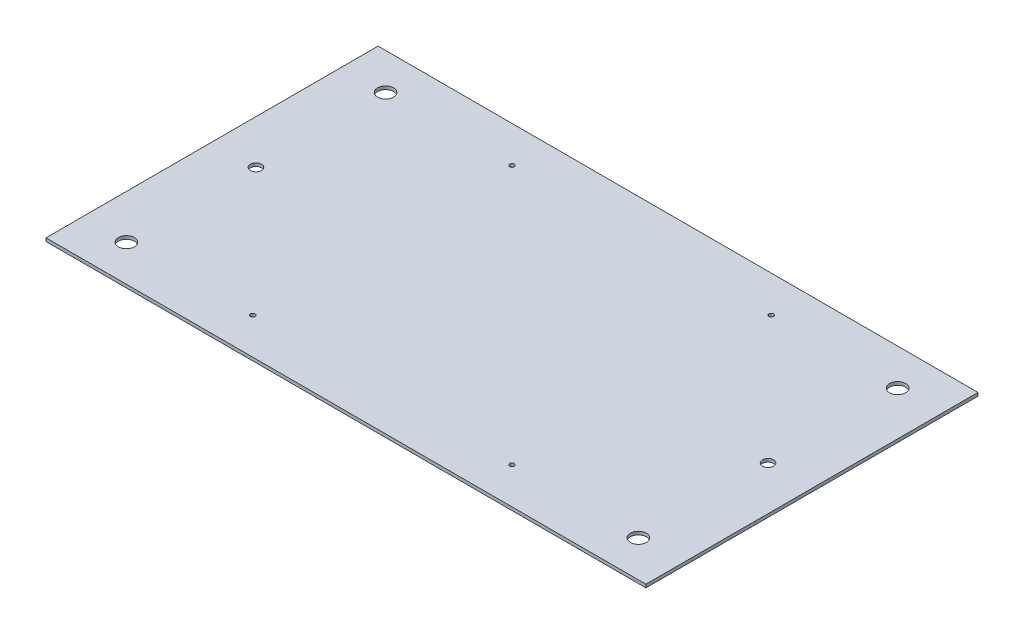
ISO-10303-21;
HEADER;
FILE_DESCRIPTION(('STEP AP214'),'2;1');
FILE_NAME('part.step','',(''),(''),'','','');
FILE_SCHEMA(('AUTOMOTIVE_DESIGN { 1 0 10303 214 1 1 1 1 }'));
ENDSEC;
DATA;
#1=APPLICATION_CONTEXT('core data for automotive mechanical design processes');
#2=APPLICATION_PROTOCOL_DEFINITION('international standard','automotive_design',2000,#1);
#3=PRODUCT_CONTEXT('',#1,'mechanical');
#4=PRODUCT('Part','Part','',(#3));
#5=PRODUCT_RELATED_PRODUCT_CATEGORY('part','',(#4));
#6=PRODUCT_DEFINITION_FORMATION('','',#4);
#7=PRODUCT_DEFINITION_CONTEXT('part definition',#1,'design');
#8=PRODUCT_DEFINITION('design','',#6,#7);
#9=PRODUCT_DEFINITION_SHAPE('','',#8);
#10=(LENGTH_UNIT() NAMED_UNIT(*) SI_UNIT(.MILLI.,.METRE.));
#11=(NAMED_UNIT(*) PLANE_ANGLE_UNIT() SI_UNIT($,.RADIAN.));
#12=(NAMED_UNIT(*) SI_UNIT($,.STERADIAN.) SOLID_ANGLE_UNIT());
#13=UNCERTAINTY_MEASURE_WITH_UNIT(LENGTH_MEASURE(1.E-05),#10,'distance_accuracy_value','');
#14=(GEOMETRIC_REPRESENTATION_CONTEXT(3) GLOBAL_UNCERTAINTY_ASSIGNED_CONTEXT((#13)) GLOBAL_UNIT_ASSIGNED_CONTEXT((#10,
#11,#12)) REPRESENTATION_CONTEXT('',''));
#15=CARTESIAN_POINT('',(0.,0.,0.));
#16=DIRECTION('',(0.,0.,1.));
#17=DIRECTION('',(1.,0.,0.));
#18=AXIS2_PLACEMENT_3D('',#15,#16,#17);
#19=CARTESIAN_POINT('',(0.,3.,0.));
#20=DIRECTION('',(1.,0.,0.));
#21=DIRECTION('',(0.,0.,-1.));
#22=AXIS2_PLACEMENT_3D('',#19,#20,#21);
#23=PLANE('',#22);
#24=DIRECTION('',(0.,0.,1.));
#25=VECTOR('',#24,1.);
#26=CARTESIAN_POINT('',(0.,0.,0.));
#27=LINE('',#26,#25);
#28=CARTESIAN_POINT('',(0.,0.,-310.));
#29=VERTEX_POINT('',#28);
#30=CARTESIAN_POINT('',(0.,0.,0.));
#31=VERTEX_POINT('',#30);
#32=EDGE_CURVE('E110',#29,#31,#27,.T.);
#33=ORIENTED_EDGE('',*,*,#32,.T.);
#34=DIRECTION('',(0.,-1.,0.));
#35=VECTOR('',#34,1.);
#36=CARTESIAN_POINT('',(0.,3.,0.));
#37=LINE('',#36,#35);
#38=CARTESIAN_POINT('',(0.,3.,0.));
#39=VERTEX_POINT('',#38);
#40=EDGE_CURVE('E11',#39,#31,#37,.T.);
#41=ORIENTED_EDGE('',*,*,#40,.F.);
#42=DIRECTION('',(0.,0.,1.));
#43=VECTOR('',#42,1.);
#44=CARTESIAN_POINT('',(0.,3.,0.));
#45=LINE('',#44,#43);
#46=CARTESIAN_POINT('',(0.,3.,-310.));
#47=VERTEX_POINT('',#46);
#48=EDGE_CURVE('E94',#47,#39,#45,.T.);
#49=ORIENTED_EDGE('',*,*,#48,.F.);
#50=DIRECTION('',(0.,-1.,0.));
#51=VECTOR('',#50,1.);
#52=CARTESIAN_POINT('',(0.,3.,-310.));
#53=LINE('',#52,#51);
#54=EDGE_CURVE('E106',#47,#29,#53,.T.);
#55=ORIENTED_EDGE('',*,*,#54,.T.);
#56=EDGE_LOOP('',(#33,#41,#49,#55));
#57=FACE_BOUND('',#56,.T.);
#58=ADVANCED_FACE('F42',(#57),#23,.F.);
#59=CARTESIAN_POINT('',(0.,3.,0.));
#60=DIRECTION('',(0.,0.,-1.));
#61=DIRECTION('',(-1.,0.,0.));
#62=AXIS2_PLACEMENT_3D('',#59,#60,#61);
#63=PLANE('',#62);
#64=DIRECTION('',(1.,0.,0.));
#65=VECTOR('',#64,1.);
#66=CARTESIAN_POINT('',(0.,0.,0.));
#67=LINE('',#66,#65);
#68=CARTESIAN_POINT('',(560.,0.,0.));
#69=VERTEX_POINT('',#68);
#70=EDGE_CURVE('E99',#31,#69,#67,.T.);
#71=ORIENTED_EDGE('',*,*,#70,.T.);
#72=DIRECTION('',(0.,-1.,0.));
#73=VECTOR('',#72,1.);
#74=CARTESIAN_POINT('',(560.,3.,0.));
#75=LINE('',#74,#73);
#76=CARTESIAN_POINT('',(560.,3.,0.));
#77=VERTEX_POINT('',#76);
#78=EDGE_CURVE('E51',#77,#69,#75,.T.);
#79=ORIENTED_EDGE('',*,*,#78,.F.);
#80=DIRECTION('',(1.,0.,0.));
#81=VECTOR('',#80,1.);
#82=CARTESIAN_POINT('',(0.,3.,0.));
#83=LINE('',#82,#81);
#84=EDGE_CURVE('E89',#39,#77,#83,.T.);
#85=ORIENTED_EDGE('',*,*,#84,.F.);
#86=ORIENTED_EDGE('',*,*,#40,.T.);
#87=EDGE_LOOP('',(#71,#79,#85,#86));
#88=FACE_BOUND('',#87,.T.);
#89=ADVANCED_FACE('F98',(#88),#63,.F.);
#90=CARTESIAN_POINT('',(560.,3.,0.));
#91=DIRECTION('',(-1.,0.,0.));
#92=DIRECTION('',(0.,0.,1.));
#93=AXIS2_PLACEMENT_3D('',#90,#91,#92);
#94=PLANE('',#93);
#95=DIRECTION('',(0.,0.,-1.));
#96=VECTOR('',#95,1.);
#97=CARTESIAN_POINT('',(560.,0.,0.));
#98=LINE('',#97,#96);
#99=CARTESIAN_POINT('',(560.,0.,-310.));
#100=VERTEX_POINT('',#99);
#101=EDGE_CURVE('E76',#69,#100,#98,.T.);
#102=ORIENTED_EDGE('',*,*,#101,.T.);
#103=DIRECTION('',(0.,-1.,0.));
#104=VECTOR('',#103,1.);
#105=CARTESIAN_POINT('',(560.,3.,-310.));
#106=LINE('',#105,#104);
#107=CARTESIAN_POINT('',(560.,3.,-310.));
#108=VERTEX_POINT('',#107);
#109=EDGE_CURVE('E101',#108,#100,#106,.T.);
#110=ORIENTED_EDGE('',*,*,#109,.F.);
#111=DIRECTION('',(0.,0.,-1.));
#112=VECTOR('',#111,1.);
#113=CARTESIAN_POINT('',(560.,3.,0.));
#114=LINE('',#113,#112);
#115=EDGE_CURVE('E92',#77,#108,#114,.T.);
#116=ORIENTED_EDGE('',*,*,#115,.F.);
#117=ORIENTED_EDGE('',*,*,#78,.T.);
#118=EDGE_LOOP('',(#102,#110,#116,#117));
#119=FACE_BOUND('',#118,.T.);
#120=ADVANCED_FACE('F102',(#119),#94,.F.);
#121=CARTESIAN_POINT('',(0.,3.,-310.));
#122=DIRECTION('',(0.,0.,1.));
#123=DIRECTION('',(1.,0.,0.));
#124=AXIS2_PLACEMENT_3D('',#121,#122,#123);
#125=PLANE('',#124);
#126=DIRECTION('',(-1.,0.,0.));
#127=VECTOR('',#126,1.);
#128=CARTESIAN_POINT('',(0.,0.,-310.));
#129=LINE('',#128,#127);
#130=EDGE_CURVE('E82',#100,#29,#129,.T.);
#131=ORIENTED_EDGE('',*,*,#130,.T.);
#132=ORIENTED_EDGE('',*,*,#54,.F.);
#133=DIRECTION('',(-1.,0.,0.));
#134=VECTOR('',#133,1.);
#135=CARTESIAN_POINT('',(0.,3.,-310.));
#136=LINE('',#135,#134);
#137=EDGE_CURVE('E59',#108,#47,#136,.T.);
#138=ORIENTED_EDGE('',*,*,#137,.F.);
#139=ORIENTED_EDGE('',*,*,#109,.T.);
#140=EDGE_LOOP('',(#131,#132,#138,#139));
#141=FACE_BOUND('',#140,.T.);
#142=ADVANCED_FACE('F124',(#141),#125,.F.);
#143=CARTESIAN_POINT('',(0.,3.,0.));
#144=DIRECTION('',(0.,-1.,0.));
#145=DIRECTION('',(0.,0.,-1.));
#146=AXIS2_PLACEMENT_3D('',#143,#144,#145);
#147=PLANE('',#146);
#148=CARTESIAN_POINT('',(519.,3.,-34.));
#149=DIRECTION('',(0.,1.,0.));
#150=DIRECTION('',(0.,0.,1.));
#151=AXIS2_PLACEMENT_3D('',#148,#149,#150);
#152=CIRCLE('',#151,7.49999999999995);
#153=CARTESIAN_POINT('',(519.,3.,-26.5));
#154=VERTEX_POINT('',#153);
#155=EDGE_CURVE('E191',#154,#154,#152,.T.);
#156=ORIENTED_EDGE('',*,*,#155,.F.);
#157=EDGE_LOOP('',(#156));
#158=FACE_BOUND('',#157,.T.);
#159=CARTESIAN_POINT('',(519.,3.,-276.));
#160=DIRECTION('',(0.,1.,0.));
#161=DIRECTION('',(0.,0.,1.));
#162=AXIS2_PLACEMENT_3D('',#159,#160,#161);
#163=CIRCLE('',#162,7.49999999999996);
#164=CARTESIAN_POINT('',(519.,3.,-268.5));
#165=VERTEX_POINT('',#164);
#166=EDGE_CURVE('E199',#165,#165,#163,.T.);
#167=ORIENTED_EDGE('',*,*,#166,.F.);
#168=EDGE_LOOP('',(#167));
#169=FACE_BOUND('',#168,.T.);
#170=CARTESIAN_POINT('',(41.,3.,-276.));
#171=DIRECTION('',(0.,1.,0.));
#172=DIRECTION('',(0.,0.,1.));
#173=AXIS2_PLACEMENT_3D('',#170,#171,#172);
#174=CIRCLE('',#173,7.5);
#175=CARTESIAN_POINT('',(41.,3.,-268.5));
#176=VERTEX_POINT('',#175);
#177=EDGE_CURVE('E183',#176,#176,#174,.T.);
#178=ORIENTED_EDGE('',*,*,#177,.F.);
#179=EDGE_LOOP('',(#178));
#180=FACE_BOUND('',#179,.T.);
#181=CARTESIAN_POINT('',(41.,3.,-34.));
#182=DIRECTION('',(0.,1.,0.));
#183=DIRECTION('',(0.,0.,1.));
#184=AXIS2_PLACEMENT_3D('',#181,#182,#183);
#185=CIRCLE('',#184,7.5);
#186=CARTESIAN_POINT('',(41.,3.,-26.5));
#187=VERTEX_POINT('',#186);
#188=EDGE_CURVE('E179',#187,#187,#185,.T.);
#189=ORIENTED_EDGE('',*,*,#188,.F.);
#190=EDGE_LOOP('',(#189));
#191=FACE_BOUND('',#190,.T.);
#192=CARTESIAN_POINT('',(41.,3.,-155.));
#193=DIRECTION('',(0.,1.,0.));
#194=DIRECTION('',(0.,0.,1.));
#195=AXIS2_PLACEMENT_3D('',#192,#193,#194);
#196=CIRCLE('',#195,5.15);
#197=CARTESIAN_POINT('',(41.,3.,-149.85));
#198=VERTEX_POINT('',#197);
#199=EDGE_CURVE('E172',#198,#198,#196,.T.);
#200=ORIENTED_EDGE('',*,*,#199,.F.);
#201=EDGE_LOOP('',(#200));
#202=FACE_BOUND('',#201,.T.);
#203=CARTESIAN_POINT('',(519.,3.,-155.));
#204=DIRECTION('',(0.,1.,0.));
#205=DIRECTION('',(0.,0.,1.));
#206=AXIS2_PLACEMENT_3D('',#203,#204,#205);
#207=CIRCLE('',#206,5.15000000000001);
#208=CARTESIAN_POINT('',(519.,3.,-149.85));
#209=VERTEX_POINT('',#208);
#210=EDGE_CURVE('E167',#209,#209,#207,.T.);
#211=ORIENTED_EDGE('',*,*,#210,.F.);
#212=EDGE_LOOP('',(#211));
#213=FACE_BOUND('',#212,.T.);
#214=CARTESIAN_POINT('',(159.,3.,-34.));
#215=DIRECTION('',(0.,1.,0.));
#216=DIRECTION('',(0.,0.,1.));
#217=AXIS2_PLACEMENT_3D('',#214,#215,#216);
#218=CIRCLE('',#217,2.15000000000002);
#219=CARTESIAN_POINT('',(159.,3.,-31.85));
#220=VERTEX_POINT('',#219);
#221=EDGE_CURVE('E143',#220,#220,#218,.T.);
#222=ORIENTED_EDGE('',*,*,#221,.F.);
#223=EDGE_LOOP('',(#222));
#224=FACE_BOUND('',#223,.T.);
#225=CARTESIAN_POINT('',(401.,3.,-34.));
#226=DIRECTION('',(0.,1.,0.));
#227=DIRECTION('',(0.,0.,1.));
#228=AXIS2_PLACEMENT_3D('',#225,#226,#227);
#229=CIRCLE('',#228,2.14999999999996);
#230=CARTESIAN_POINT('',(401.,3.,-31.85));
#231=VERTEX_POINT('',#230);
#232=EDGE_CURVE('E152',#231,#231,#229,.T.);
#233=ORIENTED_EDGE('',*,*,#232,.F.);
#234=EDGE_LOOP('',(#233));
#235=FACE_BOUND('',#234,.T.);
#236=CARTESIAN_POINT('',(401.,3.,-276.));
#237=DIRECTION('',(0.,1.,0.));
#238=DIRECTION('',(0.,0.,1.));
#239=AXIS2_PLACEMENT_3D('',#236,#237,#238);
#240=CIRCLE('',#239,2.14999999999997);
#241=CARTESIAN_POINT('',(401.,3.,-273.85));
#242=VERTEX_POINT('',#241);
#243=EDGE_CURVE('E135',#242,#242,#240,.T.);
#244=ORIENTED_EDGE('',*,*,#243,.F.);
#245=EDGE_LOOP('',(#244));
#246=FACE_BOUND('',#245,.T.);
#247=CARTESIAN_POINT('',(159.,3.,-276.));
#248=DIRECTION('',(0.,1.,0.));
#249=DIRECTION('',(0.,0.,1.));
#250=AXIS2_PLACEMENT_3D('',#247,#248,#249);
#251=CIRCLE('',#250,2.15000000000002);
#252=CARTESIAN_POINT('',(159.,3.,-273.85));
#253=VERTEX_POINT('',#252);
#254=EDGE_CURVE('E131',#253,#253,#251,.T.);
#255=ORIENTED_EDGE('',*,*,#254,.F.);
#256=EDGE_LOOP('',(#255));
#257=FACE_BOUND('',#256,.T.);
#258=ORIENTED_EDGE('',*,*,#48,.T.);
#259=ORIENTED_EDGE('',*,*,#84,.T.);
#260=ORIENTED_EDGE('',*,*,#115,.T.);
#261=ORIENTED_EDGE('',*,*,#137,.T.);
#262=EDGE_LOOP('',(#258,#259,#260,#261));
#263=FACE_BOUND('',#262,.T.);
#264=ADVANCED_FACE('F90',(#158,#169,#180,#191,#202,#213,#224,#235,#246,#257,#263),#147,.F.);
#265=CARTESIAN_POINT('',(0.,0.,0.));
#266=DIRECTION('',(0.,-1.,0.));
#267=DIRECTION('',(0.,0.,-1.));
#268=AXIS2_PLACEMENT_3D('',#265,#266,#267);
#269=PLANE('',#268);
#270=CARTESIAN_POINT('',(519.,0.,-34.));
#271=DIRECTION('',(0.,1.,0.));
#272=DIRECTION('',(0.,0.,1.));
#273=AXIS2_PLACEMENT_3D('',#270,#271,#272);
#274=CIRCLE('',#273,7.49999999999995);
#275=CARTESIAN_POINT('',(519.,0.,-26.5));
#276=VERTEX_POINT('',#275);
#277=EDGE_CURVE('E187',#276,#276,#274,.T.);
#278=ORIENTED_EDGE('',*,*,#277,.T.);
#279=EDGE_LOOP('',(#278));
#280=FACE_BOUND('',#279,.T.);
#281=CARTESIAN_POINT('',(519.,0.,-276.));
#282=DIRECTION('',(0.,1.,0.));
#283=DIRECTION('',(0.,0.,1.));
#284=AXIS2_PLACEMENT_3D('',#281,#282,#283);
#285=CIRCLE('',#284,7.49999999999996);
#286=CARTESIAN_POINT('',(519.,0.,-268.5));
#287=VERTEX_POINT('',#286);
#288=EDGE_CURVE('E195',#287,#287,#285,.T.);
#289=ORIENTED_EDGE('',*,*,#288,.T.);
#290=EDGE_LOOP('',(#289));
#291=FACE_BOUND('',#290,.T.);
#292=CARTESIAN_POINT('',(41.,0.,-276.));
#293=DIRECTION('',(0.,1.,0.));
#294=DIRECTION('',(0.,0.,1.));
#295=AXIS2_PLACEMENT_3D('',#292,#293,#294);
#296=CIRCLE('',#295,7.5);
#297=CARTESIAN_POINT('',(41.,0.,-268.5));
#298=VERTEX_POINT('',#297);
#299=EDGE_CURVE('E203',#298,#298,#296,.T.);
#300=ORIENTED_EDGE('',*,*,#299,.T.);
#301=EDGE_LOOP('',(#300));
#302=FACE_BOUND('',#301,.T.);
#303=CARTESIAN_POINT('',(41.,0.,-34.));
#304=DIRECTION('',(0.,1.,0.));
#305=DIRECTION('',(0.,0.,1.));
#306=AXIS2_PLACEMENT_3D('',#303,#304,#305);
#307=CIRCLE('',#306,7.5);
#308=CARTESIAN_POINT('',(41.,0.,-26.5));
#309=VERTEX_POINT('',#308);
#310=EDGE_CURVE('E168',#309,#309,#307,.T.);
#311=ORIENTED_EDGE('',*,*,#310,.T.);
#312=EDGE_LOOP('',(#311));
#313=FACE_BOUND('',#312,.T.);
#314=CARTESIAN_POINT('',(41.,0.,-155.));
#315=DIRECTION('',(0.,1.,0.));
#316=DIRECTION('',(0.,0.,1.));
#317=AXIS2_PLACEMENT_3D('',#314,#315,#316);
#318=CIRCLE('',#317,5.15);
#319=CARTESIAN_POINT('',(41.,0.,-149.85));
#320=VERTEX_POINT('',#319);
#321=EDGE_CURVE('E144',#320,#320,#318,.T.);
#322=ORIENTED_EDGE('',*,*,#321,.T.);
#323=EDGE_LOOP('',(#322));
#324=FACE_BOUND('',#323,.T.);
#325=CARTESIAN_POINT('',(519.,0.,-155.));
#326=DIRECTION('',(0.,1.,0.));
#327=DIRECTION('',(0.,0.,1.));
#328=AXIS2_PLACEMENT_3D('',#325,#326,#327);
#329=CIRCLE('',#328,5.15000000000001);
#330=CARTESIAN_POINT('',(519.,0.,-149.85));
#331=VERTEX_POINT('',#330);
#332=EDGE_CURVE('E163',#331,#331,#329,.T.);
#333=ORIENTED_EDGE('',*,*,#332,.T.);
#334=EDGE_LOOP('',(#333));
#335=FACE_BOUND('',#334,.T.);
#336=CARTESIAN_POINT('',(159.,0.,-34.));
#337=DIRECTION('',(0.,1.,0.));
#338=DIRECTION('',(0.,0.,1.));
#339=AXIS2_PLACEMENT_3D('',#336,#337,#338);
#340=CIRCLE('',#339,2.15000000000002);
#341=CARTESIAN_POINT('',(159.,0.,-31.85));
#342=VERTEX_POINT('',#341);
#343=EDGE_CURVE('E139',#342,#342,#340,.T.);
#344=ORIENTED_EDGE('',*,*,#343,.T.);
#345=EDGE_LOOP('',(#344));
#346=FACE_BOUND('',#345,.T.);
#347=CARTESIAN_POINT('',(401.,0.,-34.));
#348=DIRECTION('',(0.,1.,0.));
#349=DIRECTION('',(0.,0.,1.));
#350=AXIS2_PLACEMENT_3D('',#347,#348,#349);
#351=CIRCLE('',#350,2.14999999999996);
#352=CARTESIAN_POINT('',(401.,0.,-31.85));
#353=VERTEX_POINT('',#352);
#354=EDGE_CURVE('E148',#353,#353,#351,.T.);
#355=ORIENTED_EDGE('',*,*,#354,.T.);
#356=EDGE_LOOP('',(#355));
#357=FACE_BOUND('',#356,.T.);
#358=CARTESIAN_POINT('',(401.,0.,-276.));
#359=DIRECTION('',(0.,1.,0.));
#360=DIRECTION('',(0.,0.,1.));
#361=AXIS2_PLACEMENT_3D('',#358,#359,#360);
#362=CIRCLE('',#361,2.14999999999997);
#363=CARTESIAN_POINT('',(401.,0.,-273.85));
#364=VERTEX_POINT('',#363);
#365=EDGE_CURVE('E156',#364,#364,#362,.T.);
#366=ORIENTED_EDGE('',*,*,#365,.T.);
#367=EDGE_LOOP('',(#366));
#368=FACE_BOUND('',#367,.T.);
#369=CARTESIAN_POINT('',(159.,0.,-276.));
#370=DIRECTION('',(0.,1.,0.));
#371=DIRECTION('',(0.,0.,1.));
#372=AXIS2_PLACEMENT_3D('',#369,#370,#371);
#373=CIRCLE('',#372,2.15000000000002);
#374=CARTESIAN_POINT('',(159.,0.,-273.85));
#375=VERTEX_POINT('',#374);
#376=EDGE_CURVE('E114',#375,#375,#373,.T.);
#377=ORIENTED_EDGE('',*,*,#376,.T.);
#378=EDGE_LOOP('',(#377));
#379=FACE_BOUND('',#378,.T.);
#380=ORIENTED_EDGE('',*,*,#32,.F.);
#381=ORIENTED_EDGE('',*,*,#130,.F.);
#382=ORIENTED_EDGE('',*,*,#101,.F.);
#383=ORIENTED_EDGE('',*,*,#70,.F.);
#384=EDGE_LOOP('',(#380,#381,#382,#383));
#385=FACE_BOUND('',#384,.T.);
#386=ADVANCED_FACE('F127',(#280,#291,#302,#313,#324,#335,#346,#357,#368,#379,#385),#269,.T.);
#387=CARTESIAN_POINT('',(159.,0.,-276.));
#388=DIRECTION('',(0.,1.,0.));
#389=DIRECTION('',(0.,0.,1.));
#390=AXIS2_PLACEMENT_3D('',#387,#388,#389);
#391=CYLINDRICAL_SURFACE('',#390,2.15000000000002);
#392=ORIENTED_EDGE('',*,*,#376,.F.);
#393=EDGE_LOOP('',(#392));
#394=FACE_BOUND('',#393,.T.);
#395=ORIENTED_EDGE('',*,*,#254,.T.);
#396=EDGE_LOOP('',(#395));
#397=FACE_BOUND('',#396,.T.);
#398=ADVANCED_FACE('F231',(#394,#397),#391,.F.);
#399=CARTESIAN_POINT('',(401.,0.,-276.));
#400=DIRECTION('',(0.,1.,0.));
#401=DIRECTION('',(0.,0.,1.));
#402=AXIS2_PLACEMENT_3D('',#399,#400,#401);
#403=CYLINDRICAL_SURFACE('',#402,2.14999999999997);
#404=ORIENTED_EDGE('',*,*,#365,.F.);
#405=EDGE_LOOP('',(#404));
#406=FACE_BOUND('',#405,.T.);
#407=ORIENTED_EDGE('',*,*,#243,.T.);
#408=EDGE_LOOP('',(#407));
#409=FACE_BOUND('',#408,.T.);
#410=ADVANCED_FACE('F233',(#406,#409),#403,.F.);
#411=CARTESIAN_POINT('',(401.,0.,-34.));
#412=DIRECTION('',(0.,1.,0.));
#413=DIRECTION('',(0.,0.,1.));
#414=AXIS2_PLACEMENT_3D('',#411,#412,#413);
#415=CYLINDRICAL_SURFACE('',#414,2.14999999999996);
#416=ORIENTED_EDGE('',*,*,#354,.F.);
#417=EDGE_LOOP('',(#416));
#418=FACE_BOUND('',#417,.T.);
#419=ORIENTED_EDGE('',*,*,#232,.T.);
#420=EDGE_LOOP('',(#419));
#421=FACE_BOUND('',#420,.T.);
#422=ADVANCED_FACE('F240',(#418,#421),#415,.F.);
#423=CARTESIAN_POINT('',(159.,0.,-34.));
#424=DIRECTION('',(0.,1.,0.));
#425=DIRECTION('',(0.,0.,1.));
#426=AXIS2_PLACEMENT_3D('',#423,#424,#425);
#427=CYLINDRICAL_SURFACE('',#426,2.15000000000002);
#428=ORIENTED_EDGE('',*,*,#343,.F.);
#429=EDGE_LOOP('',(#428));
#430=FACE_BOUND('',#429,.T.);
#431=ORIENTED_EDGE('',*,*,#221,.T.);
#432=EDGE_LOOP('',(#431));
#433=FACE_BOUND('',#432,.T.);
#434=ADVANCED_FACE('F341',(#430,#433),#427,.F.);
#435=CARTESIAN_POINT('',(519.,0.,-155.));
#436=DIRECTION('',(0.,1.,0.));
#437=DIRECTION('',(0.,0.,1.));
#438=AXIS2_PLACEMENT_3D('',#435,#436,#437);
#439=CYLINDRICAL_SURFACE('',#438,5.15000000000001);
#440=ORIENTED_EDGE('',*,*,#332,.F.);
#441=EDGE_LOOP('',(#440));
#442=FACE_BOUND('',#441,.T.);
#443=ORIENTED_EDGE('',*,*,#210,.T.);
#444=EDGE_LOOP('',(#443));
#445=FACE_BOUND('',#444,.T.);
#446=ADVANCED_FACE('F332',(#442,#445),#439,.F.);
#447=CARTESIAN_POINT('',(41.,0.,-155.));
#448=DIRECTION('',(0.,1.,0.));
#449=DIRECTION('',(0.,0.,1.));
#450=AXIS2_PLACEMENT_3D('',#447,#448,#449);
#451=CYLINDRICAL_SURFACE('',#450,5.15);
#452=ORIENTED_EDGE('',*,*,#321,.F.);
#453=EDGE_LOOP('',(#452));
#454=FACE_BOUND('',#453,.T.);
#455=ORIENTED_EDGE('',*,*,#199,.T.);
#456=EDGE_LOOP('',(#455));
#457=FACE_BOUND('',#456,.T.);
#458=ADVANCED_FACE('F285',(#454,#457),#451,.F.);
#459=CARTESIAN_POINT('',(41.,0.,-34.));
#460=DIRECTION('',(0.,1.,0.));
#461=DIRECTION('',(0.,0.,1.));
#462=AXIS2_PLACEMENT_3D('',#459,#460,#461);
#463=CYLINDRICAL_SURFACE('',#462,7.5);
#464=ORIENTED_EDGE('',*,*,#310,.F.);
#465=EDGE_LOOP('',(#464));
#466=FACE_BOUND('',#465,.T.);
#467=ORIENTED_EDGE('',*,*,#188,.T.);
#468=EDGE_LOOP('',(#467));
#469=FACE_BOUND('',#468,.T.);
#470=ADVANCED_FACE('F280',(#466,#469),#463,.F.);
#471=CARTESIAN_POINT('',(41.,0.,-276.));
#472=DIRECTION('',(0.,1.,0.));
#473=DIRECTION('',(0.,0.,1.));
#474=AXIS2_PLACEMENT_3D('',#471,#472,#473);
#475=CYLINDRICAL_SURFACE('',#474,7.5);
#476=ORIENTED_EDGE('',*,*,#299,.F.);
#477=EDGE_LOOP('',(#476));
#478=FACE_BOUND('',#477,.T.);
#479=ORIENTED_EDGE('',*,*,#177,.T.);
#480=EDGE_LOOP('',(#479));
#481=FACE_BOUND('',#480,.T.);
#482=ADVANCED_FACE('F211',(#478,#481),#475,.F.);
#483=CARTESIAN_POINT('',(519.,0.,-276.));
#484=DIRECTION('',(0.,1.,0.));
#485=DIRECTION('',(0.,0.,1.));
#486=AXIS2_PLACEMENT_3D('',#483,#484,#485);
#487=CYLINDRICAL_SURFACE('',#486,7.49999999999996);
#488=ORIENTED_EDGE('',*,*,#288,.F.);
#489=EDGE_LOOP('',(#488));
#490=FACE_BOUND('',#489,.T.);
#491=ORIENTED_EDGE('',*,*,#166,.T.);
#492=EDGE_LOOP('',(#491));
#493=FACE_BOUND('',#492,.T.);
#494=ADVANCED_FACE('F298',(#490,#493),#487,.F.);
#495=CARTESIAN_POINT('',(519.,0.,-34.));
#496=DIRECTION('',(0.,1.,0.));
#497=DIRECTION('',(0.,0.,1.));
#498=AXIS2_PLACEMENT_3D('',#495,#496,#497);
#499=CYLINDRICAL_SURFACE('',#498,7.49999999999995);
#500=ORIENTED_EDGE('',*,*,#277,.F.);
#501=EDGE_LOOP('',(#500));
#502=FACE_BOUND('',#501,.T.);
#503=ORIENTED_EDGE('',*,*,#155,.T.);
#504=EDGE_LOOP('',(#503));
#505=FACE_BOUND('',#504,.T.);
#506=ADVANCED_FACE('F309',(#502,#505),#499,.F.);
#507=CLOSED_SHELL('',(#58,#89,#120,#142,#264,#386,#398,#410,#422,#434,#446,#458,#470,#482,#494,#506));
#508=MANIFOLD_SOLID_BREP('B2',#507);
#509=ADVANCED_BREP_SHAPE_REPRESENTATION('',(#18,#508),#14);
#510=SHAPE_DEFINITION_REPRESENTATION(#9,#509);
ENDSEC;
END-ISO-10303-21;
